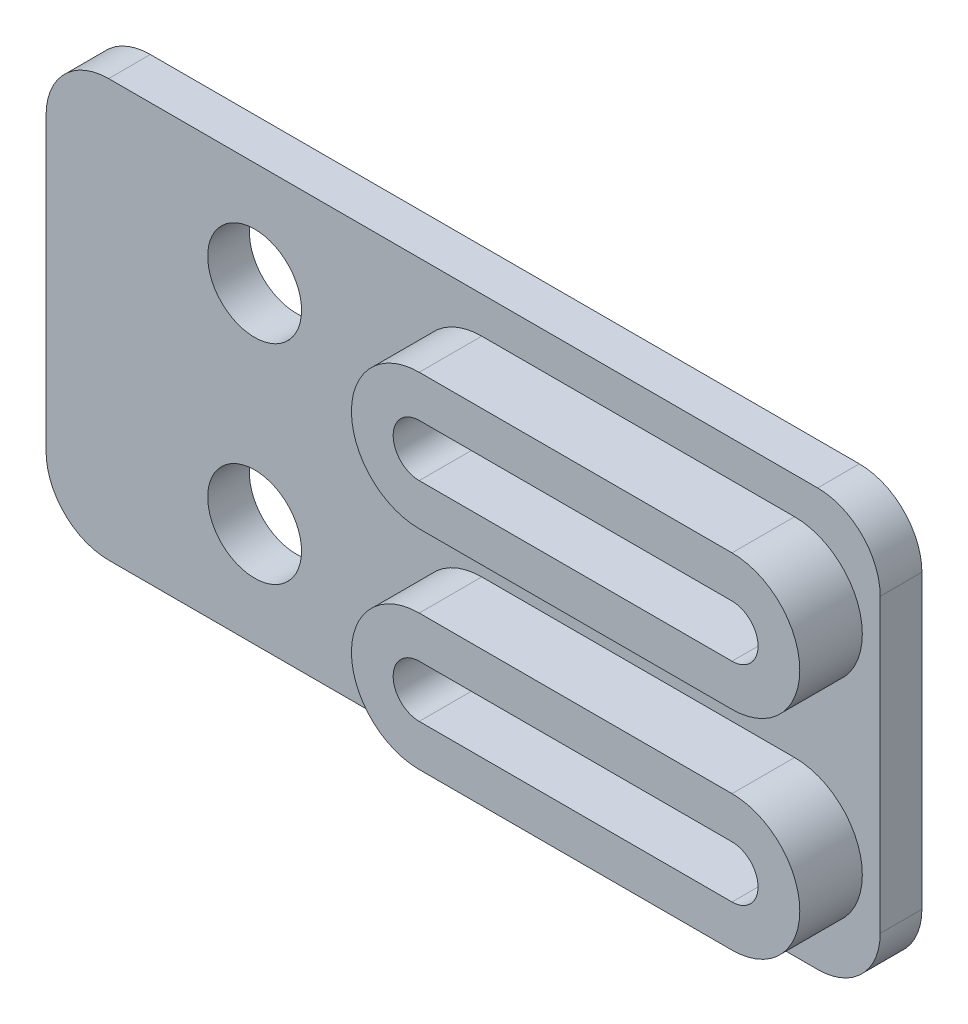
ISO-10303-21;
HEADER;
FILE_DESCRIPTION(('STEP AP214'),'2;1');
FILE_NAME('part.step','',(''),(''),'','','');
FILE_SCHEMA(('AUTOMOTIVE_DESIGN { 1 0 10303 214 1 1 1 1 }'));
ENDSEC;
DATA;
#1=APPLICATION_CONTEXT('core data for automotive mechanical design processes');
#2=APPLICATION_PROTOCOL_DEFINITION('international standard','automotive_design',2000,#1);
#3=PRODUCT_CONTEXT('',#1,'mechanical');
#4=PRODUCT('Part','Part','',(#3));
#5=PRODUCT_RELATED_PRODUCT_CATEGORY('part','',(#4));
#6=PRODUCT_DEFINITION_FORMATION('','',#4);
#7=PRODUCT_DEFINITION_CONTEXT('part definition',#1,'design');
#8=PRODUCT_DEFINITION('design','',#6,#7);
#9=PRODUCT_DEFINITION_SHAPE('','',#8);
#10=(LENGTH_UNIT() NAMED_UNIT(*) SI_UNIT(.MILLI.,.METRE.));
#11=(NAMED_UNIT(*) PLANE_ANGLE_UNIT() SI_UNIT($,.RADIAN.));
#12=(NAMED_UNIT(*) SI_UNIT($,.STERADIAN.) SOLID_ANGLE_UNIT());
#13=UNCERTAINTY_MEASURE_WITH_UNIT(LENGTH_MEASURE(1.E-05),#10,'distance_accuracy_value','');
#14=(GEOMETRIC_REPRESENTATION_CONTEXT(3) GLOBAL_UNCERTAINTY_ASSIGNED_CONTEXT((#13)) GLOBAL_UNIT_ASSIGNED_CONTEXT((#10,
#11,#12)) REPRESENTATION_CONTEXT('',''));
#15=CARTESIAN_POINT('',(0.,0.,0.));
#16=DIRECTION('',(0.,0.,1.));
#17=DIRECTION('',(1.,0.,0.));
#18=AXIS2_PLACEMENT_3D('',#15,#16,#17);
#19=CARTESIAN_POINT('',(20.494567618363,0.,2.));
#20=DIRECTION('',(1.,0.,0.));
#21=DIRECTION('',(0.,1.,0.));
#22=AXIS2_PLACEMENT_3D('',#19,#20,#21);
#23=PLANE('',#22);
#24=DIRECTION('',(0.,-1.,0.));
#25=VECTOR('',#24,1.);
#26=CARTESIAN_POINT('',(20.494567618363,0.,2.));
#27=LINE('',#26,#25);
#28=CARTESIAN_POINT('',(20.494567618363,7.28639258627393,2.));
#29=VERTEX_POINT('',#28);
#30=CARTESIAN_POINT('',(20.494567618363,-6.71360741372607,2.));
#31=VERTEX_POINT('',#30);
#32=EDGE_CURVE('E336',#29,#31,#27,.T.);
#33=ORIENTED_EDGE('',*,*,#32,.T.);
#34=DIRECTION('',(0.,0.,-1.));
#35=VECTOR('',#34,1.);
#36=CARTESIAN_POINT('',(20.494567618363,-6.71360741372607,0.));
#37=LINE('',#36,#35);
#38=CARTESIAN_POINT('',(20.494567618363,-6.71360741372607,0.));
#39=VERTEX_POINT('',#38);
#40=EDGE_CURVE('E390',#31,#39,#37,.T.);
#41=ORIENTED_EDGE('',*,*,#40,.T.);
#42=DIRECTION('',(0.,-1.,0.));
#43=VECTOR('',#42,1.);
#44=CARTESIAN_POINT('',(20.494567618363,0.,0.));
#45=LINE('',#44,#43);
#46=CARTESIAN_POINT('',(20.494567618363,7.28639258627393,0.));
#47=VERTEX_POINT('',#46);
#48=EDGE_CURVE('E353',#47,#39,#45,.T.);
#49=ORIENTED_EDGE('',*,*,#48,.F.);
#50=DIRECTION('',(0.,0.,-1.));
#51=VECTOR('',#50,1.);
#52=CARTESIAN_POINT('',(20.494567618363,7.28639258627393,2.));
#53=LINE('',#52,#51);
#54=EDGE_CURVE('E388',#47,#29,#53,.F.);
#55=ORIENTED_EDGE('',*,*,#54,.T.);
#56=EDGE_LOOP('',(#33,#41,#49,#55));
#57=FACE_BOUND('',#56,.T.);
#58=ADVANCED_FACE('F59',(#57),#23,.T.);
#59=CARTESIAN_POINT('',(0.,10.2863925862739,2.));
#60=DIRECTION('',(0.,1.,0.));
#61=DIRECTION('',(0.,0.,1.));
#62=AXIS2_PLACEMENT_3D('',#59,#60,#61);
#63=PLANE('',#62);
#64=DIRECTION('',(1.,0.,0.));
#65=VECTOR('',#64,1.);
#66=CARTESIAN_POINT('',(0.,10.2863925862739,2.));
#67=LINE('',#66,#65);
#68=CARTESIAN_POINT('',(-16.505432381637,10.2863925862739,2.));
#69=VERTEX_POINT('',#68);
#70=CARTESIAN_POINT('',(17.494567618363,10.2863925862739,2.));
#71=VERTEX_POINT('',#70);
#72=EDGE_CURVE('E339',#69,#71,#67,.T.);
#73=ORIENTED_EDGE('',*,*,#72,.T.);
#74=DIRECTION('',(0.,0.,-1.));
#75=VECTOR('',#74,1.);
#76=CARTESIAN_POINT('',(17.494567618363,10.2863925862739,2.));
#77=LINE('',#76,#75);
#78=CARTESIAN_POINT('',(17.494567618363,10.2863925862739,0.));
#79=VERTEX_POINT('',#78);
#80=EDGE_CURVE('E12',#71,#79,#77,.T.);
#81=ORIENTED_EDGE('',*,*,#80,.T.);
#82=DIRECTION('',(1.,0.,0.));
#83=VECTOR('',#82,1.);
#84=CARTESIAN_POINT('',(0.,10.2863925862739,0.));
#85=LINE('',#84,#83);
#86=CARTESIAN_POINT('',(-16.505432381637,10.2863925862739,0.));
#87=VERTEX_POINT('',#86);
#88=EDGE_CURVE('E356',#87,#79,#85,.T.);
#89=ORIENTED_EDGE('',*,*,#88,.F.);
#90=DIRECTION('',(0.,0.,-1.));
#91=VECTOR('',#90,1.);
#92=CARTESIAN_POINT('',(-16.505432381637,10.2863925862739,2.));
#93=LINE('',#92,#91);
#94=EDGE_CURVE('E67',#87,#69,#93,.F.);
#95=ORIENTED_EDGE('',*,*,#94,.T.);
#96=EDGE_LOOP('',(#73,#81,#89,#95));
#97=FACE_BOUND('',#96,.T.);
#98=ADVANCED_FACE('F405',(#97),#63,.T.);
#99=CARTESIAN_POINT('',(-19.505432381637,0.,2.));
#100=DIRECTION('',(1.,0.,0.));
#101=DIRECTION('',(0.,1.,0.));
#102=AXIS2_PLACEMENT_3D('',#99,#100,#101);
#103=PLANE('',#102);
#104=DIRECTION('',(0.,-1.,0.));
#105=VECTOR('',#104,1.);
#106=CARTESIAN_POINT('',(-19.505432381637,0.,0.));
#107=LINE('',#106,#105);
#108=CARTESIAN_POINT('',(-19.505432381637,7.28639258627393,0.));
#109=VERTEX_POINT('',#108);
#110=CARTESIAN_POINT('',(-19.505432381637,-6.71360741372607,0.));
#111=VERTEX_POINT('',#110);
#112=EDGE_CURVE('E359',#109,#111,#107,.T.);
#113=ORIENTED_EDGE('',*,*,#112,.T.);
#114=DIRECTION('',(0.,0.,-1.));
#115=VECTOR('',#114,1.);
#116=CARTESIAN_POINT('',(-19.505432381637,-6.71360741372607,2.));
#117=LINE('',#116,#115);
#118=CARTESIAN_POINT('',(-19.505432381637,-6.71360741372607,2.));
#119=VERTEX_POINT('',#118);
#120=EDGE_CURVE('E379',#111,#119,#117,.F.);
#121=ORIENTED_EDGE('',*,*,#120,.T.);
#122=DIRECTION('',(0.,-1.,0.));
#123=VECTOR('',#122,1.);
#124=CARTESIAN_POINT('',(-19.505432381637,0.,2.));
#125=LINE('',#124,#123);
#126=CARTESIAN_POINT('',(-19.505432381637,7.28639258627393,2.));
#127=VERTEX_POINT('',#126);
#128=EDGE_CURVE('E341',#127,#119,#125,.T.);
#129=ORIENTED_EDGE('',*,*,#128,.F.);
#130=DIRECTION('',(0.,0.,-1.));
#131=VECTOR('',#130,1.);
#132=CARTESIAN_POINT('',(-19.505432381637,7.28639258627393,0.));
#133=LINE('',#132,#131);
#134=EDGE_CURVE('E376',#127,#109,#133,.T.);
#135=ORIENTED_EDGE('',*,*,#134,.T.);
#136=EDGE_LOOP('',(#113,#121,#129,#135));
#137=FACE_BOUND('',#136,.T.);
#138=ADVANCED_FACE('F413',(#137),#103,.F.);
#139=CARTESIAN_POINT('',(-9.50543238163698,5.28639258627393,2.));
#140=DIRECTION('',(0.,0.,-1.));
#141=DIRECTION('',(-1.,0.,0.));
#142=AXIS2_PLACEMENT_3D('',#139,#140,#141);
#143=CYLINDRICAL_SURFACE('',#142,2.25);
#144=CARTESIAN_POINT('',(-9.50543238163698,5.28639258627393,2.));
#145=DIRECTION('',(0.,0.,1.));
#146=DIRECTION('',(1.,0.,0.));
#147=AXIS2_PLACEMENT_3D('',#144,#145,#146);
#148=CIRCLE('',#147,2.25);
#149=CARTESIAN_POINT('',(-7.25543238163698,5.28639258627393,2.));
#150=VERTEX_POINT('',#149);
#151=EDGE_CURVE('E333',#150,#150,#148,.T.);
#152=ORIENTED_EDGE('',*,*,#151,.T.);
#153=EDGE_LOOP('',(#152));
#154=FACE_BOUND('',#153,.T.);
#155=CARTESIAN_POINT('',(-9.50543238163698,5.28639258627393,0.));
#156=DIRECTION('',(0.,0.,1.));
#157=DIRECTION('',(1.,0.,0.));
#158=AXIS2_PLACEMENT_3D('',#155,#156,#157);
#159=CIRCLE('',#158,2.25);
#160=CARTESIAN_POINT('',(-7.25543238163698,5.28639258627393,0.));
#161=VERTEX_POINT('',#160);
#162=EDGE_CURVE('E350',#161,#161,#159,.T.);
#163=ORIENTED_EDGE('',*,*,#162,.F.);
#164=EDGE_LOOP('',(#163));
#165=FACE_BOUND('',#164,.T.);
#166=ADVANCED_FACE('F439',(#154,#165),#143,.F.);
#167=CARTESIAN_POINT('',(-9.50543238163698,-4.71360741372608,2.));
#168=DIRECTION('',(0.,0.,-1.));
#169=DIRECTION('',(-1.,0.,0.));
#170=AXIS2_PLACEMENT_3D('',#167,#168,#169);
#171=CYLINDRICAL_SURFACE('',#170,2.25);
#172=CARTESIAN_POINT('',(-9.50543238163698,-4.71360741372608,2.));
#173=DIRECTION('',(0.,0.,1.));
#174=DIRECTION('',(1.,0.,0.));
#175=AXIS2_PLACEMENT_3D('',#172,#173,#174);
#176=CIRCLE('',#175,2.25);
#177=CARTESIAN_POINT('',(-7.25543238163698,-4.71360741372608,2.));
#178=VERTEX_POINT('',#177);
#179=EDGE_CURVE('E330',#178,#178,#176,.T.);
#180=ORIENTED_EDGE('',*,*,#179,.T.);
#181=EDGE_LOOP('',(#180));
#182=FACE_BOUND('',#181,.T.);
#183=CARTESIAN_POINT('',(-9.50543238163698,-4.71360741372608,0.));
#184=DIRECTION('',(0.,0.,1.));
#185=DIRECTION('',(1.,0.,0.));
#186=AXIS2_PLACEMENT_3D('',#183,#184,#185);
#187=CIRCLE('',#186,2.25);
#188=CARTESIAN_POINT('',(-7.25543238163698,-4.71360741372608,0.));
#189=VERTEX_POINT('',#188);
#190=EDGE_CURVE('E301',#189,#189,#187,.T.);
#191=ORIENTED_EDGE('',*,*,#190,.F.);
#192=EDGE_LOOP('',(#191));
#193=FACE_BOUND('',#192,.T.);
#194=ADVANCED_FACE('F442',(#182,#193),#171,.F.);
#195=CARTESIAN_POINT('',(0.,-9.71360741372607,2.));
#196=DIRECTION('',(0.,1.,0.));
#197=DIRECTION('',(0.,0.,1.));
#198=AXIS2_PLACEMENT_3D('',#195,#196,#197);
#199=PLANE('',#198);
#200=DIRECTION('',(1.,0.,0.));
#201=VECTOR('',#200,1.);
#202=CARTESIAN_POINT('',(0.,-9.71360741372607,2.));
#203=LINE('',#202,#201);
#204=CARTESIAN_POINT('',(-16.505432381637,-9.71360741372607,2.));
#205=VERTEX_POINT('',#204);
#206=CARTESIAN_POINT('',(17.494567618363,-9.71360741372607,2.));
#207=VERTEX_POINT('',#206);
#208=EDGE_CURVE('E344',#205,#207,#203,.T.);
#209=ORIENTED_EDGE('',*,*,#208,.F.);
#210=DIRECTION('',(0.,0.,-1.));
#211=VECTOR('',#210,1.);
#212=CARTESIAN_POINT('',(-16.505432381637,-9.71360741372607,2.));
#213=LINE('',#212,#211);
#214=CARTESIAN_POINT('',(-16.505432381637,-9.71360741372607,0.));
#215=VERTEX_POINT('',#214);
#216=EDGE_CURVE('E365',#205,#215,#213,.T.);
#217=ORIENTED_EDGE('',*,*,#216,.T.);
#218=DIRECTION('',(1.,0.,0.));
#219=VECTOR('',#218,1.);
#220=CARTESIAN_POINT('',(0.,-9.71360741372607,0.));
#221=LINE('',#220,#219);
#222=CARTESIAN_POINT('',(17.494567618363,-9.71360741372607,0.));
#223=VERTEX_POINT('',#222);
#224=EDGE_CURVE('E312',#215,#223,#221,.T.);
#225=ORIENTED_EDGE('',*,*,#224,.T.);
#226=DIRECTION('',(0.,0.,-1.));
#227=VECTOR('',#226,1.);
#228=CARTESIAN_POINT('',(17.494567618363,-9.71360741372607,2.));
#229=LINE('',#228,#227);
#230=EDGE_CURVE('E347',#223,#207,#229,.F.);
#231=ORIENTED_EDGE('',*,*,#230,.T.);
#232=EDGE_LOOP('',(#209,#217,#225,#231));
#233=FACE_BOUND('',#232,.T.);
#234=ADVANCED_FACE('F421',(#233),#199,.F.);
#235=CARTESIAN_POINT('',(0.,0.,2.));
#236=DIRECTION('',(0.,0.,1.));
#237=DIRECTION('',(1.,0.,0.));
#238=AXIS2_PLACEMENT_3D('',#235,#236,#237);
#239=PLANE('',#238);
#240=CARTESIAN_POINT('',(16.3875778274388,5.28639258627393,2.));
#241=DIRECTION('',(0.,0.,1.));
#242=DIRECTION('',(1.,0.,0.));
#243=AXIS2_PLACEMENT_3D('',#240,#241,#242);
#244=CIRCLE('',#243,3.25);
#245=CARTESIAN_POINT('',(16.3875778274388,2.03639258627393,2.));
#246=VERTEX_POINT('',#245);
#247=CARTESIAN_POINT('',(16.3875778274388,8.53639258627393,2.));
#248=VERTEX_POINT('',#247);
#249=EDGE_CURVE('E308',#246,#248,#244,.T.);
#250=ORIENTED_EDGE('',*,*,#249,.F.);
#251=DIRECTION('',(1.,0.,0.));
#252=VECTOR('',#251,1.);
#253=CARTESIAN_POINT('',(0.,2.03639258627393,2.));
#254=LINE('',#253,#252);
#255=CARTESIAN_POINT('',(1.3875778274388,2.03639258627393,2.));
#256=VERTEX_POINT('',#255);
#257=EDGE_CURVE('E311',#256,#246,#254,.T.);
#258=ORIENTED_EDGE('',*,*,#257,.F.);
#259=CARTESIAN_POINT('',(1.3875778274388,5.28639258627393,2.));
#260=DIRECTION('',(0.,0.,1.));
#261=DIRECTION('',(1.,0.,0.));
#262=AXIS2_PLACEMENT_3D('',#259,#260,#261);
#263=CIRCLE('',#262,3.25);
#264=CARTESIAN_POINT('',(1.3875778274388,8.53639258627393,2.));
#265=VERTEX_POINT('',#264);
#266=EDGE_CURVE('E314',#265,#256,#263,.T.);
#267=ORIENTED_EDGE('',*,*,#266,.F.);
#268=DIRECTION('',(1.,0.,0.));
#269=VECTOR('',#268,1.);
#270=CARTESIAN_POINT('',(0.,8.53639258627393,2.));
#271=LINE('',#270,#269);
#272=EDGE_CURVE('E316',#265,#248,#271,.T.);
#273=ORIENTED_EDGE('',*,*,#272,.T.);
#274=EDGE_LOOP('',(#250,#258,#267,#273));
#275=FACE_BOUND('',#274,.T.);
#276=CARTESIAN_POINT('',(16.3875778274388,-4.71360741372608,2.));
#277=DIRECTION('',(0.,0.,1.));
#278=DIRECTION('',(1.,0.,0.));
#279=AXIS2_PLACEMENT_3D('',#276,#277,#278);
#280=CIRCLE('',#279,3.25);
#281=CARTESIAN_POINT('',(16.3875778274388,-7.96360741372608,2.));
#282=VERTEX_POINT('',#281);
#283=CARTESIAN_POINT('',(16.3875778274388,-1.46360741372607,2.));
#284=VERTEX_POINT('',#283);
#285=EDGE_CURVE('E319',#282,#284,#280,.T.);
#286=ORIENTED_EDGE('',*,*,#285,.F.);
#287=DIRECTION('',(1.,0.,0.));
#288=VECTOR('',#287,1.);
#289=CARTESIAN_POINT('',(0.,-7.96360741372608,2.));
#290=LINE('',#289,#288);
#291=CARTESIAN_POINT('',(1.3875778274388,-7.96360741372608,2.));
#292=VERTEX_POINT('',#291);
#293=EDGE_CURVE('E322',#292,#282,#290,.T.);
#294=ORIENTED_EDGE('',*,*,#293,.F.);
#295=CARTESIAN_POINT('',(1.3875778274388,-4.71360741372608,2.));
#296=DIRECTION('',(0.,0.,1.));
#297=DIRECTION('',(1.,0.,0.));
#298=AXIS2_PLACEMENT_3D('',#295,#296,#297);
#299=CIRCLE('',#298,3.25);
#300=CARTESIAN_POINT('',(1.3875778274388,-1.46360741372607,2.));
#301=VERTEX_POINT('',#300);
#302=EDGE_CURVE('E325',#301,#292,#299,.T.);
#303=ORIENTED_EDGE('',*,*,#302,.F.);
#304=DIRECTION('',(1.,0.,0.));
#305=VECTOR('',#304,1.);
#306=CARTESIAN_POINT('',(0.,-1.46360741372607,2.));
#307=LINE('',#306,#305);
#308=EDGE_CURVE('E328',#301,#284,#307,.T.);
#309=ORIENTED_EDGE('',*,*,#308,.T.);
#310=EDGE_LOOP('',(#286,#294,#303,#309));
#311=FACE_BOUND('',#310,.T.);
#312=ORIENTED_EDGE('',*,*,#179,.F.);
#313=EDGE_LOOP('',(#312));
#314=FACE_BOUND('',#313,.T.);
#315=ORIENTED_EDGE('',*,*,#151,.F.);
#316=EDGE_LOOP('',(#315));
#317=FACE_BOUND('',#316,.T.);
#318=ORIENTED_EDGE('',*,*,#128,.T.);
#319=CARTESIAN_POINT('',(-16.505432381637,-6.71360741372607,2.));
#320=DIRECTION('',(0.,0.,1.));
#321=DIRECTION('',(1.,0.,0.));
#322=AXIS2_PLACEMENT_3D('',#319,#320,#321);
#323=CIRCLE('',#322,3.);
#324=EDGE_CURVE('E386',#119,#205,#323,.T.);
#325=ORIENTED_EDGE('',*,*,#324,.T.);
#326=ORIENTED_EDGE('',*,*,#208,.T.);
#327=CARTESIAN_POINT('',(17.494567618363,-6.71360741372607,2.));
#328=DIRECTION('',(0.,0.,1.));
#329=DIRECTION('',(1.,0.,0.));
#330=AXIS2_PLACEMENT_3D('',#327,#328,#329);
#331=CIRCLE('',#330,3.);
#332=EDGE_CURVE('E384',#207,#31,#331,.T.);
#333=ORIENTED_EDGE('',*,*,#332,.T.);
#334=ORIENTED_EDGE('',*,*,#32,.F.);
#335=CARTESIAN_POINT('',(17.494567618363,7.28639258627393,2.));
#336=DIRECTION('',(0.,0.,1.));
#337=DIRECTION('',(1.,0.,0.));
#338=AXIS2_PLACEMENT_3D('',#335,#336,#337);
#339=CIRCLE('',#338,3.);
#340=EDGE_CURVE('E74',#29,#71,#339,.T.);
#341=ORIENTED_EDGE('',*,*,#340,.T.);
#342=ORIENTED_EDGE('',*,*,#72,.F.);
#343=CARTESIAN_POINT('',(-16.505432381637,7.28639258627393,2.));
#344=DIRECTION('',(0.,0.,1.));
#345=DIRECTION('',(1.,0.,0.));
#346=AXIS2_PLACEMENT_3D('',#343,#344,#345);
#347=CIRCLE('',#346,3.);
#348=EDGE_CURVE('E381',#69,#127,#347,.T.);
#349=ORIENTED_EDGE('',*,*,#348,.T.);
#350=EDGE_LOOP('',(#318,#325,#326,#333,#334,#341,#342,#349));
#351=FACE_BOUND('',#350,.T.);
#352=ADVANCED_FACE('F407',(#275,#311,#314,#317,#351),#239,.T.);
#353=CARTESIAN_POINT('',(0.,0.,0.));
#354=DIRECTION('',(0.,0.,1.));
#355=DIRECTION('',(1.,0.,0.));
#356=AXIS2_PLACEMENT_3D('',#353,#354,#355);
#357=PLANE('',#356);
#358=ORIENTED_EDGE('',*,*,#190,.T.);
#359=EDGE_LOOP('',(#358));
#360=FACE_BOUND('',#359,.T.);
#361=ORIENTED_EDGE('',*,*,#162,.T.);
#362=EDGE_LOOP('',(#361));
#363=FACE_BOUND('',#362,.T.);
#364=ORIENTED_EDGE('',*,*,#224,.F.);
#365=CARTESIAN_POINT('',(-16.505432381637,-6.71360741372607,0.));
#366=DIRECTION('',(0.,0.,1.));
#367=DIRECTION('',(1.,0.,0.));
#368=AXIS2_PLACEMENT_3D('',#365,#366,#367);
#369=CIRCLE('',#368,3.);
#370=EDGE_CURVE('E374',#215,#111,#369,.F.);
#371=ORIENTED_EDGE('',*,*,#370,.T.);
#372=ORIENTED_EDGE('',*,*,#112,.F.);
#373=CARTESIAN_POINT('',(-16.505432381637,7.28639258627393,0.));
#374=DIRECTION('',(0.,0.,1.));
#375=DIRECTION('',(1.,0.,0.));
#376=AXIS2_PLACEMENT_3D('',#373,#374,#375);
#377=CIRCLE('',#376,3.);
#378=EDGE_CURVE('E368',#109,#87,#377,.F.);
#379=ORIENTED_EDGE('',*,*,#378,.T.);
#380=ORIENTED_EDGE('',*,*,#88,.T.);
#381=CARTESIAN_POINT('',(17.494567618363,7.28639258627393,0.));
#382=DIRECTION('',(0.,0.,1.));
#383=DIRECTION('',(1.,0.,0.));
#384=AXIS2_PLACEMENT_3D('',#381,#382,#383);
#385=CIRCLE('',#384,3.);
#386=EDGE_CURVE('E370',#79,#47,#385,.F.);
#387=ORIENTED_EDGE('',*,*,#386,.T.);
#388=ORIENTED_EDGE('',*,*,#48,.T.);
#389=CARTESIAN_POINT('',(17.494567618363,-6.71360741372607,0.));
#390=DIRECTION('',(0.,0.,1.));
#391=DIRECTION('',(1.,0.,0.));
#392=AXIS2_PLACEMENT_3D('',#389,#390,#391);
#393=CIRCLE('',#392,3.);
#394=EDGE_CURVE('E372',#39,#223,#393,.F.);
#395=ORIENTED_EDGE('',*,*,#394,.T.);
#396=EDGE_LOOP('',(#364,#371,#372,#379,#380,#387,#388,#395));
#397=FACE_BOUND('',#396,.T.);
#398=CARTESIAN_POINT('',(16.3875778274388,-4.71360741372608,0.));
#399=DIRECTION('',(0.,0.,1.));
#400=DIRECTION('',(1.,0.,0.));
#401=AXIS2_PLACEMENT_3D('',#398,#399,#400);
#402=CIRCLE('',#401,1.25);
#403=CARTESIAN_POINT('',(16.3875778274388,-5.96360741372608,0.));
#404=VERTEX_POINT('',#403);
#405=CARTESIAN_POINT('',(16.3875778274388,-3.46360741372607,0.));
#406=VERTEX_POINT('',#405);
#407=EDGE_CURVE('E277',#404,#406,#402,.T.);
#408=ORIENTED_EDGE('',*,*,#407,.T.);
#409=DIRECTION('',(1.,0.,0.));
#410=VECTOR('',#409,1.);
#411=CARTESIAN_POINT('',(0.,-3.46360741372607,0.));
#412=LINE('',#411,#410);
#413=CARTESIAN_POINT('',(1.3875778274388,-3.46360741372607,0.));
#414=VERTEX_POINT('',#413);
#415=EDGE_CURVE('E258',#414,#406,#412,.T.);
#416=ORIENTED_EDGE('',*,*,#415,.F.);
#417=CARTESIAN_POINT('',(1.3875778274388,-4.71360741372608,0.));
#418=DIRECTION('',(0.,0.,1.));
#419=DIRECTION('',(1.,0.,0.));
#420=AXIS2_PLACEMENT_3D('',#417,#418,#419);
#421=CIRCLE('',#420,1.25);
#422=CARTESIAN_POINT('',(1.3875778274388,-5.96360741372608,0.));
#423=VERTEX_POINT('',#422);
#424=EDGE_CURVE('E283',#414,#423,#421,.T.);
#425=ORIENTED_EDGE('',*,*,#424,.T.);
#426=DIRECTION('',(1.,0.,0.));
#427=VECTOR('',#426,1.);
#428=CARTESIAN_POINT('',(0.,-5.96360741372608,0.));
#429=LINE('',#428,#427);
#430=EDGE_CURVE('E280',#423,#404,#429,.T.);
#431=ORIENTED_EDGE('',*,*,#430,.T.);
#432=EDGE_LOOP('',(#408,#416,#425,#431));
#433=FACE_BOUND('',#432,.T.);
#434=CARTESIAN_POINT('',(1.3875778274388,5.28639258627393,0.));
#435=DIRECTION('',(0.,0.,1.));
#436=DIRECTION('',(1.,0.,0.));
#437=AXIS2_PLACEMENT_3D('',#434,#435,#436);
#438=CIRCLE('',#437,1.25);
#439=CARTESIAN_POINT('',(1.3875778274388,6.53639258627393,0.));
#440=VERTEX_POINT('',#439);
#441=CARTESIAN_POINT('',(1.3875778274388,4.03639258627393,0.));
#442=VERTEX_POINT('',#441);
#443=EDGE_CURVE('E249',#440,#442,#438,.T.);
#444=ORIENTED_EDGE('',*,*,#443,.T.);
#445=DIRECTION('',(1.,0.,0.));
#446=VECTOR('',#445,1.);
#447=CARTESIAN_POINT('',(1.3875778274388,4.03639258627393,0.));
#448=LINE('',#447,#446);
#449=CARTESIAN_POINT('',(16.3875778274388,4.03639258627393,0.));
#450=VERTEX_POINT('',#449);
#451=EDGE_CURVE('E713',#442,#450,#448,.T.);
#452=ORIENTED_EDGE('',*,*,#451,.T.);
#453=CARTESIAN_POINT('',(16.3875778274388,5.28639258627393,0.));
#454=DIRECTION('',(0.,0.,1.));
#455=DIRECTION('',(1.,0.,0.));
#456=AXIS2_PLACEMENT_3D('',#453,#454,#455);
#457=CIRCLE('',#456,1.25);
#458=CARTESIAN_POINT('',(16.3875778274388,6.53639258627393,0.));
#459=VERTEX_POINT('',#458);
#460=EDGE_CURVE('E718',#450,#459,#457,.T.);
#461=ORIENTED_EDGE('',*,*,#460,.T.);
#462=DIRECTION('',(1.,0.,0.));
#463=VECTOR('',#462,1.);
#464=CARTESIAN_POINT('',(1.3875778274388,6.53639258627393,0.));
#465=LINE('',#464,#463);
#466=EDGE_CURVE('E229',#440,#459,#465,.T.);
#467=ORIENTED_EDGE('',*,*,#466,.F.);
#468=EDGE_LOOP('',(#444,#452,#461,#467));
#469=FACE_BOUND('',#468,.T.);
#470=ADVANCED_FACE('F400',(#360,#363,#397,#433,#469),#357,.F.);
#471=CARTESIAN_POINT('',(0.,-7.96360741372608,5.));
#472=DIRECTION('',(0.,1.,0.));
#473=DIRECTION('',(0.,0.,1.));
#474=AXIS2_PLACEMENT_3D('',#471,#472,#473);
#475=PLANE('',#474);
#476=ORIENTED_EDGE('',*,*,#293,.T.);
#477=DIRECTION('',(0.,0.,-1.));
#478=VECTOR('',#477,1.);
#479=CARTESIAN_POINT('',(16.3875778274388,-7.96360741372608,5.));
#480=LINE('',#479,#478);
#481=CARTESIAN_POINT('',(16.3875778274388,-7.96360741372608,5.));
#482=VERTEX_POINT('',#481);
#483=EDGE_CURVE('E298',#482,#282,#480,.T.);
#484=ORIENTED_EDGE('',*,*,#483,.F.);
#485=DIRECTION('',(1.,0.,0.));
#486=VECTOR('',#485,1.);
#487=CARTESIAN_POINT('',(0.,-7.96360741372608,5.));
#488=LINE('',#487,#486);
#489=CARTESIAN_POINT('',(1.3875778274388,-7.96360741372608,5.));
#490=VERTEX_POINT('',#489);
#491=EDGE_CURVE('E266',#490,#482,#488,.T.);
#492=ORIENTED_EDGE('',*,*,#491,.F.);
#493=DIRECTION('',(0.,0.,-1.));
#494=VECTOR('',#493,1.);
#495=CARTESIAN_POINT('',(1.3875778274388,-7.96360741372608,5.));
#496=LINE('',#495,#494);
#497=EDGE_CURVE('E288',#490,#292,#496,.T.);
#498=ORIENTED_EDGE('',*,*,#497,.T.);
#499=EDGE_LOOP('',(#476,#484,#492,#498));
#500=FACE_BOUND('',#499,.T.);
#501=ADVANCED_FACE('F456',(#500),#475,.F.);
#502=CARTESIAN_POINT('',(16.3875778274388,-4.71360741372608,5.));
#503=DIRECTION('',(0.,0.,-1.));
#504=DIRECTION('',(-1.,0.,0.));
#505=AXIS2_PLACEMENT_3D('',#502,#503,#504);
#506=CYLINDRICAL_SURFACE('',#505,3.25);
#507=ORIENTED_EDGE('',*,*,#285,.T.);
#508=DIRECTION('',(0.,0.,-1.));
#509=VECTOR('',#508,1.);
#510=CARTESIAN_POINT('',(16.3875778274388,-1.46360741372607,5.));
#511=LINE('',#510,#509);
#512=CARTESIAN_POINT('',(16.3875778274388,-1.46360741372607,5.));
#513=VERTEX_POINT('',#512);
#514=EDGE_CURVE('E295',#513,#284,#511,.T.);
#515=ORIENTED_EDGE('',*,*,#514,.F.);
#516=CARTESIAN_POINT('',(16.3875778274388,-4.71360741372608,5.));
#517=DIRECTION('',(0.,0.,1.));
#518=DIRECTION('',(1.,0.,0.));
#519=AXIS2_PLACEMENT_3D('',#516,#517,#518);
#520=CIRCLE('',#519,3.25);
#521=EDGE_CURVE('E269',#482,#513,#520,.T.);
#522=ORIENTED_EDGE('',*,*,#521,.F.);
#523=ORIENTED_EDGE('',*,*,#483,.T.);
#524=EDGE_LOOP('',(#507,#515,#522,#523));
#525=FACE_BOUND('',#524,.T.);
#526=ADVANCED_FACE('F464',(#525),#506,.T.);
#527=CARTESIAN_POINT('',(0.,-1.46360741372607,5.));
#528=DIRECTION('',(0.,1.,0.));
#529=DIRECTION('',(0.,0.,1.));
#530=AXIS2_PLACEMENT_3D('',#527,#528,#529);
#531=PLANE('',#530);
#532=ORIENTED_EDGE('',*,*,#514,.T.);
#533=ORIENTED_EDGE('',*,*,#308,.F.);
#534=DIRECTION('',(0.,0.,-1.));
#535=VECTOR('',#534,1.);
#536=CARTESIAN_POINT('',(1.3875778274388,-1.46360741372607,5.));
#537=LINE('',#536,#535);
#538=CARTESIAN_POINT('',(1.3875778274388,-1.46360741372607,5.));
#539=VERTEX_POINT('',#538);
#540=EDGE_CURVE('E291',#539,#301,#537,.T.);
#541=ORIENTED_EDGE('',*,*,#540,.F.);
#542=DIRECTION('',(1.,0.,0.));
#543=VECTOR('',#542,1.);
#544=CARTESIAN_POINT('',(0.,-1.46360741372607,5.));
#545=LINE('',#544,#543);
#546=EDGE_CURVE('E271',#539,#513,#545,.T.);
#547=ORIENTED_EDGE('',*,*,#546,.T.);
#548=EDGE_LOOP('',(#532,#533,#541,#547));
#549=FACE_BOUND('',#548,.T.);
#550=ADVANCED_FACE('F501',(#549),#531,.T.);
#551=CARTESIAN_POINT('',(16.3875778274388,-4.71360741372608,5.));
#552=DIRECTION('',(0.,0.,-1.));
#553=DIRECTION('',(-1.,0.,0.));
#554=AXIS2_PLACEMENT_3D('',#551,#552,#553);
#555=CYLINDRICAL_SURFACE('',#554,1.25);
#556=ORIENTED_EDGE('',*,*,#407,.F.);
#557=DIRECTION('',(0.,0.,-1.));
#558=VECTOR('',#557,1.);
#559=CARTESIAN_POINT('',(16.3875778274388,-5.96360741372608,5.));
#560=LINE('',#559,#558);
#561=CARTESIAN_POINT('',(16.3875778274388,-5.96360741372608,5.));
#562=VERTEX_POINT('',#561);
#563=EDGE_CURVE('E292',#562,#404,#560,.T.);
#564=ORIENTED_EDGE('',*,*,#563,.F.);
#565=CARTESIAN_POINT('',(16.3875778274388,-4.71360741372608,5.));
#566=DIRECTION('',(0.,0.,1.));
#567=DIRECTION('',(1.,0.,0.));
#568=AXIS2_PLACEMENT_3D('',#565,#566,#567);
#569=CIRCLE('',#568,1.25);
#570=CARTESIAN_POINT('',(16.3875778274388,-3.46360741372607,5.));
#571=VERTEX_POINT('',#570);
#572=EDGE_CURVE('E254',#562,#571,#569,.T.);
#573=ORIENTED_EDGE('',*,*,#572,.T.);
#574=DIRECTION('',(0.,0.,-1.));
#575=VECTOR('',#574,1.);
#576=CARTESIAN_POINT('',(16.3875778274388,-3.46360741372607,5.));
#577=LINE('',#576,#575);
#578=EDGE_CURVE('E276',#571,#406,#577,.T.);
#579=ORIENTED_EDGE('',*,*,#578,.T.);
#580=EDGE_LOOP('',(#556,#564,#573,#579));
#581=FACE_BOUND('',#580,.T.);
#582=ADVANCED_FACE('F511',(#581),#555,.F.);
#583=CARTESIAN_POINT('',(0.,-5.96360741372608,5.));
#584=DIRECTION('',(0.,1.,0.));
#585=DIRECTION('',(0.,0.,1.));
#586=AXIS2_PLACEMENT_3D('',#583,#584,#585);
#587=PLANE('',#586);
#588=ORIENTED_EDGE('',*,*,#430,.F.);
#589=DIRECTION('',(0.,0.,-1.));
#590=VECTOR('',#589,1.);
#591=CARTESIAN_POINT('',(1.3875778274388,-5.96360741372608,5.));
#592=LINE('',#591,#590);
#593=CARTESIAN_POINT('',(1.3875778274388,-5.96360741372608,5.));
#594=VERTEX_POINT('',#593);
#595=EDGE_CURVE('E305',#594,#423,#592,.T.);
#596=ORIENTED_EDGE('',*,*,#595,.F.);
#597=DIRECTION('',(1.,0.,0.));
#598=VECTOR('',#597,1.);
#599=CARTESIAN_POINT('',(0.,-5.96360741372608,5.));
#600=LINE('',#599,#598);
#601=EDGE_CURVE('E257',#594,#562,#600,.T.);
#602=ORIENTED_EDGE('',*,*,#601,.T.);
#603=ORIENTED_EDGE('',*,*,#563,.T.);
#604=EDGE_LOOP('',(#588,#596,#602,#603));
#605=FACE_BOUND('',#604,.T.);
#606=ADVANCED_FACE('F521',(#605),#587,.T.);
#607=CARTESIAN_POINT('',(1.3875778274388,-4.71360741372608,5.));
#608=DIRECTION('',(0.,0.,-1.));
#609=DIRECTION('',(-1.,0.,0.));
#610=AXIS2_PLACEMENT_3D('',#607,#608,#609);
#611=CYLINDRICAL_SURFACE('',#610,1.25);
#612=ORIENTED_EDGE('',*,*,#424,.F.);
#613=DIRECTION('',(0.,0.,-1.));
#614=VECTOR('',#613,1.);
#615=CARTESIAN_POINT('',(1.3875778274388,-3.46360741372607,5.));
#616=LINE('',#615,#614);
#617=CARTESIAN_POINT('',(1.3875778274388,-3.46360741372607,5.));
#618=VERTEX_POINT('',#617);
#619=EDGE_CURVE('E303',#618,#414,#616,.T.);
#620=ORIENTED_EDGE('',*,*,#619,.F.);
#621=CARTESIAN_POINT('',(1.3875778274388,-4.71360741372608,5.));
#622=DIRECTION('',(0.,0.,1.));
#623=DIRECTION('',(1.,0.,0.));
#624=AXIS2_PLACEMENT_3D('',#621,#622,#623);
#625=CIRCLE('',#624,1.25);
#626=EDGE_CURVE('E261',#618,#594,#625,.T.);
#627=ORIENTED_EDGE('',*,*,#626,.T.);
#628=ORIENTED_EDGE('',*,*,#595,.T.);
#629=EDGE_LOOP('',(#612,#620,#627,#628));
#630=FACE_BOUND('',#629,.T.);
#631=ADVANCED_FACE('F530',(#630),#611,.F.);
#632=CARTESIAN_POINT('',(0.,-3.46360741372607,5.));
#633=DIRECTION('',(0.,1.,0.));
#634=DIRECTION('',(0.,0.,1.));
#635=AXIS2_PLACEMENT_3D('',#632,#633,#634);
#636=PLANE('',#635);
#637=ORIENTED_EDGE('',*,*,#415,.T.);
#638=ORIENTED_EDGE('',*,*,#578,.F.);
#639=DIRECTION('',(1.,0.,0.));
#640=VECTOR('',#639,1.);
#641=CARTESIAN_POINT('',(0.,-3.46360741372607,5.));
#642=LINE('',#641,#640);
#643=EDGE_CURVE('E264',#618,#571,#642,.T.);
#644=ORIENTED_EDGE('',*,*,#643,.F.);
#645=ORIENTED_EDGE('',*,*,#619,.T.);
#646=EDGE_LOOP('',(#637,#638,#644,#645));
#647=FACE_BOUND('',#646,.T.);
#648=ADVANCED_FACE('F540',(#647),#636,.F.);
#649=CARTESIAN_POINT('',(1.3875778274388,-4.71360741372608,5.));
#650=DIRECTION('',(0.,0.,-1.));
#651=DIRECTION('',(-1.,0.,0.));
#652=AXIS2_PLACEMENT_3D('',#649,#650,#651);
#653=CYLINDRICAL_SURFACE('',#652,3.25);
#654=ORIENTED_EDGE('',*,*,#302,.T.);
#655=ORIENTED_EDGE('',*,*,#497,.F.);
#656=CARTESIAN_POINT('',(1.3875778274388,-4.71360741372608,5.));
#657=DIRECTION('',(0.,0.,1.));
#658=DIRECTION('',(1.,0.,0.));
#659=AXIS2_PLACEMENT_3D('',#656,#657,#658);
#660=CIRCLE('',#659,3.25);
#661=EDGE_CURVE('E274',#539,#490,#660,.T.);
#662=ORIENTED_EDGE('',*,*,#661,.F.);
#663=ORIENTED_EDGE('',*,*,#540,.T.);
#664=EDGE_LOOP('',(#654,#655,#662,#663));
#665=FACE_BOUND('',#664,.T.);
#666=ADVANCED_FACE('F550',(#665),#653,.T.);
#667=CARTESIAN_POINT('',(0.,0.,5.));
#668=DIRECTION('',(0.,0.,1.));
#669=DIRECTION('',(1.,0.,0.));
#670=AXIS2_PLACEMENT_3D('',#667,#668,#669);
#671=PLANE('',#670);
#672=ORIENTED_EDGE('',*,*,#572,.F.);
#673=ORIENTED_EDGE('',*,*,#601,.F.);
#674=ORIENTED_EDGE('',*,*,#626,.F.);
#675=ORIENTED_EDGE('',*,*,#643,.T.);
#676=EDGE_LOOP('',(#672,#673,#674,#675));
#677=FACE_BOUND('',#676,.T.);
#678=ORIENTED_EDGE('',*,*,#491,.T.);
#679=ORIENTED_EDGE('',*,*,#521,.T.);
#680=ORIENTED_EDGE('',*,*,#546,.F.);
#681=ORIENTED_EDGE('',*,*,#661,.T.);
#682=EDGE_LOOP('',(#678,#679,#680,#681));
#683=FACE_BOUND('',#682,.T.);
#684=ADVANCED_FACE('F560',(#677,#683),#671,.T.);
#685=CARTESIAN_POINT('',(1.3875778274388,5.28639258627393,5.));
#686=DIRECTION('',(0.,0.,1.));
#687=DIRECTION('',(1.,0.,0.));
#688=AXIS2_PLACEMENT_3D('',#685,#686,#687);
#689=PLANE('',#688);
#690=CARTESIAN_POINT('',(1.3875778274388,5.28639258627393,5.));
#691=DIRECTION('',(0.,0.,1.));
#692=DIRECTION('',(1.,0.,0.));
#693=AXIS2_PLACEMENT_3D('',#690,#691,#692);
#694=CIRCLE('',#693,3.25);
#695=CARTESIAN_POINT('',(1.3875778274388,8.53639258627393,5.));
#696=VERTEX_POINT('',#695);
#697=CARTESIAN_POINT('',(1.3875778274388,2.03639258627393,5.));
#698=VERTEX_POINT('',#697);
#699=EDGE_CURVE('E719',#696,#698,#694,.T.);
#700=ORIENTED_EDGE('',*,*,#699,.T.);
#701=DIRECTION('',(1.,0.,0.));
#702=VECTOR('',#701,1.);
#703=CARTESIAN_POINT('',(1.3875778274388,2.03639258627393,5.));
#704=LINE('',#703,#702);
#705=CARTESIAN_POINT('',(16.3875778274388,2.03639258627393,5.));
#706=VERTEX_POINT('',#705);
#707=EDGE_CURVE('E727',#698,#706,#704,.T.);
#708=ORIENTED_EDGE('',*,*,#707,.T.);
#709=CARTESIAN_POINT('',(16.3875778274388,5.28639258627393,5.));
#710=DIRECTION('',(0.,0.,1.));
#711=DIRECTION('',(1.,0.,0.));
#712=AXIS2_PLACEMENT_3D('',#709,#710,#711);
#713=CIRCLE('',#712,3.25);
#714=CARTESIAN_POINT('',(16.3875778274388,8.53639258627393,5.));
#715=VERTEX_POINT('',#714);
#716=EDGE_CURVE('E729',#706,#715,#713,.T.);
#717=ORIENTED_EDGE('',*,*,#716,.T.);
#718=DIRECTION('',(1.,0.,0.));
#719=VECTOR('',#718,1.);
#720=CARTESIAN_POINT('',(1.3875778274388,8.53639258627393,5.));
#721=LINE('',#720,#719);
#722=EDGE_CURVE('E731',#696,#715,#721,.T.);
#723=ORIENTED_EDGE('',*,*,#722,.F.);
#724=EDGE_LOOP('',(#700,#708,#717,#723));
#725=FACE_BOUND('',#724,.T.);
#726=DIRECTION('',(1.,0.,0.));
#727=VECTOR('',#726,1.);
#728=CARTESIAN_POINT('',(1.3875778274388,4.03639258627393,5.));
#729=LINE('',#728,#727);
#730=CARTESIAN_POINT('',(1.3875778274388,4.03639258627393,5.));
#731=VERTEX_POINT('',#730);
#732=CARTESIAN_POINT('',(16.3875778274388,4.03639258627393,5.));
#733=VERTEX_POINT('',#732);
#734=EDGE_CURVE('E242',#731,#733,#729,.T.);
#735=ORIENTED_EDGE('',*,*,#734,.F.);
#736=CARTESIAN_POINT('',(1.3875778274388,5.28639258627393,5.));
#737=DIRECTION('',(0.,0.,1.));
#738=DIRECTION('',(1.,0.,0.));
#739=AXIS2_PLACEMENT_3D('',#736,#737,#738);
#740=CIRCLE('',#739,1.25);
#741=CARTESIAN_POINT('',(1.3875778274388,6.53639258627393,5.));
#742=VERTEX_POINT('',#741);
#743=EDGE_CURVE('E245',#742,#731,#740,.T.);
#744=ORIENTED_EDGE('',*,*,#743,.F.);
#745=DIRECTION('',(1.,0.,0.));
#746=VECTOR('',#745,1.);
#747=CARTESIAN_POINT('',(1.3875778274388,6.53639258627393,5.));
#748=LINE('',#747,#746);
#749=CARTESIAN_POINT('',(16.3875778274388,6.53639258627393,5.));
#750=VERTEX_POINT('',#749);
#751=EDGE_CURVE('E226',#742,#750,#748,.T.);
#752=ORIENTED_EDGE('',*,*,#751,.T.);
#753=CARTESIAN_POINT('',(16.3875778274388,5.28639258627393,5.));
#754=DIRECTION('',(0.,0.,1.));
#755=DIRECTION('',(1.,0.,0.));
#756=AXIS2_PLACEMENT_3D('',#753,#754,#755);
#757=CIRCLE('',#756,1.25);
#758=EDGE_CURVE('E238',#733,#750,#757,.T.);
#759=ORIENTED_EDGE('',*,*,#758,.F.);
#760=EDGE_LOOP('',(#735,#744,#752,#759));
#761=FACE_BOUND('',#760,.T.);
#762=ADVANCED_FACE('F244',(#725,#761),#689,.T.);
#763=CARTESIAN_POINT('',(1.3875778274388,5.28639258627393,5.));
#764=DIRECTION('',(0.,0.,-1.));
#765=DIRECTION('',(-1.,0.,0.));
#766=AXIS2_PLACEMENT_3D('',#763,#764,#765);
#767=CYLINDRICAL_SURFACE('',#766,3.25);
#768=ORIENTED_EDGE('',*,*,#266,.T.);
#769=DIRECTION('',(0.,0.,-1.));
#770=VECTOR('',#769,1.);
#771=CARTESIAN_POINT('',(1.3875778274388,2.03639258627393,5.));
#772=LINE('',#771,#770);
#773=EDGE_CURVE('E742',#698,#256,#772,.T.);
#774=ORIENTED_EDGE('',*,*,#773,.F.);
#775=ORIENTED_EDGE('',*,*,#699,.F.);
#776=DIRECTION('',(0.,0.,-1.));
#777=VECTOR('',#776,1.);
#778=CARTESIAN_POINT('',(1.3875778274388,8.53639258627393,5.));
#779=LINE('',#778,#777);
#780=EDGE_CURVE('E734',#696,#265,#779,.T.);
#781=ORIENTED_EDGE('',*,*,#780,.T.);
#782=EDGE_LOOP('',(#768,#774,#775,#781));
#783=FACE_BOUND('',#782,.T.);
#784=ADVANCED_FACE('F579',(#783),#767,.T.);
#785=CARTESIAN_POINT('',(1.3875778274388,2.03639258627393,5.));
#786=DIRECTION('',(0.,1.,0.));
#787=DIRECTION('',(0.,0.,1.));
#788=AXIS2_PLACEMENT_3D('',#785,#786,#787);
#789=PLANE('',#788);
#790=ORIENTED_EDGE('',*,*,#257,.T.);
#791=DIRECTION('',(0.,0.,-1.));
#792=VECTOR('',#791,1.);
#793=CARTESIAN_POINT('',(16.3875778274388,2.03639258627393,5.));
#794=LINE('',#793,#792);
#795=EDGE_CURVE('E739',#706,#246,#794,.T.);
#796=ORIENTED_EDGE('',*,*,#795,.F.);
#797=ORIENTED_EDGE('',*,*,#707,.F.);
#798=ORIENTED_EDGE('',*,*,#773,.T.);
#799=EDGE_LOOP('',(#790,#796,#797,#798));
#800=FACE_BOUND('',#799,.T.);
#801=ADVANCED_FACE('F589',(#800),#789,.F.);
#802=CARTESIAN_POINT('',(16.3875778274388,5.28639258627393,5.));
#803=DIRECTION('',(0.,0.,-1.));
#804=DIRECTION('',(-1.,0.,0.));
#805=AXIS2_PLACEMENT_3D('',#802,#803,#804);
#806=CYLINDRICAL_SURFACE('',#805,3.25);
#807=ORIENTED_EDGE('',*,*,#249,.T.);
#808=DIRECTION('',(0.,0.,-1.));
#809=VECTOR('',#808,1.);
#810=CARTESIAN_POINT('',(16.3875778274388,8.53639258627393,5.));
#811=LINE('',#810,#809);
#812=EDGE_CURVE('E737',#715,#248,#811,.T.);
#813=ORIENTED_EDGE('',*,*,#812,.F.);
#814=ORIENTED_EDGE('',*,*,#716,.F.);
#815=ORIENTED_EDGE('',*,*,#795,.T.);
#816=EDGE_LOOP('',(#807,#813,#814,#815));
#817=FACE_BOUND('',#816,.T.);
#818=ADVANCED_FACE('F599',(#817),#806,.T.);
#819=CARTESIAN_POINT('',(1.3875778274388,8.53639258627393,5.));
#820=DIRECTION('',(0.,1.,0.));
#821=DIRECTION('',(0.,0.,1.));
#822=AXIS2_PLACEMENT_3D('',#819,#820,#821);
#823=PLANE('',#822);
#824=ORIENTED_EDGE('',*,*,#812,.T.);
#825=ORIENTED_EDGE('',*,*,#272,.F.);
#826=ORIENTED_EDGE('',*,*,#780,.F.);
#827=ORIENTED_EDGE('',*,*,#722,.T.);
#828=EDGE_LOOP('',(#824,#825,#826,#827));
#829=FACE_BOUND('',#828,.T.);
#830=ADVANCED_FACE('F609',(#829),#823,.T.);
#831=CARTESIAN_POINT('',(1.3875778274388,5.28639258627393,5.));
#832=DIRECTION('',(0.,0.,-1.));
#833=DIRECTION('',(-1.,0.,0.));
#834=AXIS2_PLACEMENT_3D('',#831,#832,#833);
#835=CYLINDRICAL_SURFACE('',#834,1.25);
#836=ORIENTED_EDGE('',*,*,#443,.F.);
#837=DIRECTION('',(0.,0.,-1.));
#838=VECTOR('',#837,1.);
#839=CARTESIAN_POINT('',(1.3875778274388,6.53639258627393,5.));
#840=LINE('',#839,#838);
#841=EDGE_CURVE('E233',#742,#440,#840,.T.);
#842=ORIENTED_EDGE('',*,*,#841,.F.);
#843=ORIENTED_EDGE('',*,*,#743,.T.);
#844=DIRECTION('',(0.,0.,-1.));
#845=VECTOR('',#844,1.);
#846=CARTESIAN_POINT('',(1.3875778274388,4.03639258627393,5.));
#847=LINE('',#846,#845);
#848=EDGE_CURVE('E715',#731,#442,#847,.T.);
#849=ORIENTED_EDGE('',*,*,#848,.T.);
#850=EDGE_LOOP('',(#836,#842,#843,#849));
#851=FACE_BOUND('',#850,.T.);
#852=ADVANCED_FACE('F619',(#851),#835,.F.);
#853=CARTESIAN_POINT('',(1.3875778274388,4.03639258627393,5.));
#854=DIRECTION('',(0.,1.,0.));
#855=DIRECTION('',(0.,0.,1.));
#856=AXIS2_PLACEMENT_3D('',#853,#854,#855);
#857=PLANE('',#856);
#858=ORIENTED_EDGE('',*,*,#451,.F.);
#859=ORIENTED_EDGE('',*,*,#848,.F.);
#860=ORIENTED_EDGE('',*,*,#734,.T.);
#861=DIRECTION('',(0.,0.,-1.));
#862=VECTOR('',#861,1.);
#863=CARTESIAN_POINT('',(16.3875778274388,4.03639258627393,5.));
#864=LINE('',#863,#862);
#865=EDGE_CURVE('E234',#733,#450,#864,.T.);
#866=ORIENTED_EDGE('',*,*,#865,.T.);
#867=EDGE_LOOP('',(#858,#859,#860,#866));
#868=FACE_BOUND('',#867,.T.);
#869=ADVANCED_FACE('F629',(#868),#857,.T.);
#870=CARTESIAN_POINT('',(16.3875778274388,5.28639258627393,5.));
#871=DIRECTION('',(0.,0.,-1.));
#872=DIRECTION('',(-1.,0.,0.));
#873=AXIS2_PLACEMENT_3D('',#870,#871,#872);
#874=CYLINDRICAL_SURFACE('',#873,1.25);
#875=ORIENTED_EDGE('',*,*,#460,.F.);
#876=ORIENTED_EDGE('',*,*,#865,.F.);
#877=ORIENTED_EDGE('',*,*,#758,.T.);
#878=DIRECTION('',(0.,0.,-1.));
#879=VECTOR('',#878,1.);
#880=CARTESIAN_POINT('',(16.3875778274388,6.53639258627393,5.));
#881=LINE('',#880,#879);
#882=EDGE_CURVE('E221',#750,#459,#881,.T.);
#883=ORIENTED_EDGE('',*,*,#882,.T.);
#884=EDGE_LOOP('',(#875,#876,#877,#883));
#885=FACE_BOUND('',#884,.T.);
#886=ADVANCED_FACE('F239',(#885),#874,.F.);
#887=CARTESIAN_POINT('',(1.3875778274388,6.53639258627393,5.));
#888=DIRECTION('',(0.,1.,0.));
#889=DIRECTION('',(0.,0.,1.));
#890=AXIS2_PLACEMENT_3D('',#887,#888,#889);
#891=PLANE('',#890);
#892=ORIENTED_EDGE('',*,*,#466,.T.);
#893=ORIENTED_EDGE('',*,*,#882,.F.);
#894=ORIENTED_EDGE('',*,*,#751,.F.);
#895=ORIENTED_EDGE('',*,*,#841,.T.);
#896=EDGE_LOOP('',(#892,#893,#894,#895));
#897=FACE_BOUND('',#896,.T.);
#898=ADVANCED_FACE('F223',(#897),#891,.F.);
#899=CARTESIAN_POINT('',(-16.505432381637,-6.71360741372607,2.));
#900=DIRECTION('',(0.,0.,-1.));
#901=DIRECTION('',(-1.,0.,0.));
#902=AXIS2_PLACEMENT_3D('',#899,#900,#901);
#903=CYLINDRICAL_SURFACE('',#902,3.);
#904=ORIENTED_EDGE('',*,*,#324,.F.);
#905=ORIENTED_EDGE('',*,*,#120,.F.);
#906=ORIENTED_EDGE('',*,*,#370,.F.);
#907=ORIENTED_EDGE('',*,*,#216,.F.);
#908=EDGE_LOOP('',(#904,#905,#906,#907));
#909=FACE_BOUND('',#908,.T.);
#910=ADVANCED_FACE('F418',(#909),#903,.T.);
#911=CARTESIAN_POINT('',(17.494567618363,-6.71360741372607,2.));
#912=DIRECTION('',(0.,0.,1.));
#913=DIRECTION('',(1.,0.,0.));
#914=AXIS2_PLACEMENT_3D('',#911,#912,#913);
#915=CYLINDRICAL_SURFACE('',#914,3.);
#916=ORIENTED_EDGE('',*,*,#332,.F.);
#917=ORIENTED_EDGE('',*,*,#230,.F.);
#918=ORIENTED_EDGE('',*,*,#394,.F.);
#919=ORIENTED_EDGE('',*,*,#40,.F.);
#920=EDGE_LOOP('',(#916,#917,#918,#919));
#921=FACE_BOUND('',#920,.T.);
#922=ADVANCED_FACE('F423',(#921),#915,.T.);
#923=CARTESIAN_POINT('',(17.494567618363,7.28639258627393,2.));
#924=DIRECTION('',(0.,0.,-1.));
#925=DIRECTION('',(-1.,0.,0.));
#926=AXIS2_PLACEMENT_3D('',#923,#924,#925);
#927=CYLINDRICAL_SURFACE('',#926,3.);
#928=ORIENTED_EDGE('',*,*,#340,.F.);
#929=ORIENTED_EDGE('',*,*,#54,.F.);
#930=ORIENTED_EDGE('',*,*,#386,.F.);
#931=ORIENTED_EDGE('',*,*,#80,.F.);
#932=EDGE_LOOP('',(#928,#929,#930,#931));
#933=FACE_BOUND('',#932,.T.);
#934=ADVANCED_FACE('F404',(#933),#927,.T.);
#935=CARTESIAN_POINT('',(-16.505432381637,7.28639258627393,2.));
#936=DIRECTION('',(0.,0.,1.));
#937=DIRECTION('',(1.,0.,0.));
#938=AXIS2_PLACEMENT_3D('',#935,#936,#937);
#939=CYLINDRICAL_SURFACE('',#938,3.);
#940=ORIENTED_EDGE('',*,*,#348,.F.);
#941=ORIENTED_EDGE('',*,*,#94,.F.);
#942=ORIENTED_EDGE('',*,*,#378,.F.);
#943=ORIENTED_EDGE('',*,*,#134,.F.);
#944=EDGE_LOOP('',(#940,#941,#942,#943));
#945=FACE_BOUND('',#944,.T.);
#946=ADVANCED_FACE('F61',(#945),#939,.T.);
#947=CLOSED_SHELL('',(#58,#98,#138,#166,#194,#234,#352,#470,#501,#526,#550,#582,#606,#631,#648,
#666,#684,#762,#784,#801,#818,#830,#852,#869,#886,#898,#910,#922,#934,#946));
#948=MANIFOLD_SOLID_BREP('B2',#947);
#949=ADVANCED_BREP_SHAPE_REPRESENTATION('',(#18,#948),#14);
#950=SHAPE_DEFINITION_REPRESENTATION(#9,#949);
ENDSEC;
END-ISO-10303-21;
